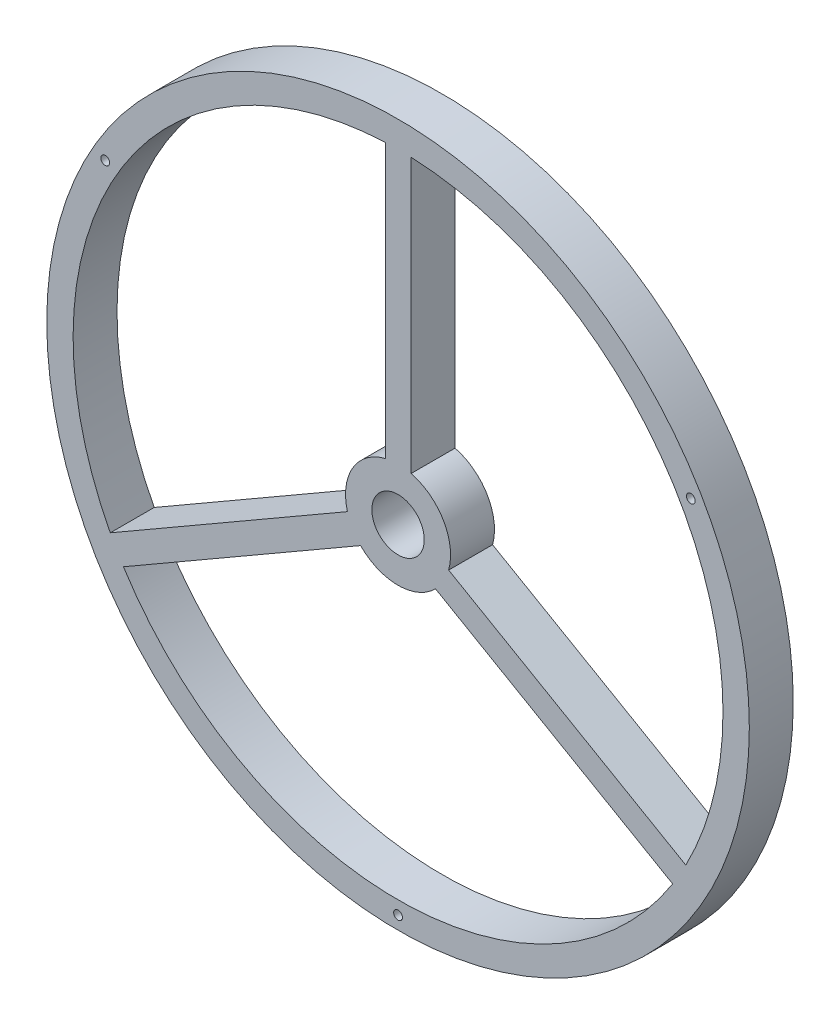
ISO-10303-21;
HEADER;
FILE_DESCRIPTION(('STEP AP214'),'2;1');
FILE_NAME('part.step','',(''),(''),'','','');
FILE_SCHEMA(('AUTOMOTIVE_DESIGN { 1 0 10303 214 1 1 1 1 }'));
ENDSEC;
DATA;
#1=APPLICATION_CONTEXT('core data for automotive mechanical design processes');
#2=APPLICATION_PROTOCOL_DEFINITION('international standard','automotive_design',2000,#1);
#3=PRODUCT_CONTEXT('',#1,'mechanical');
#4=PRODUCT('Part','Part','',(#3));
#5=PRODUCT_RELATED_PRODUCT_CATEGORY('part','',(#4));
#6=PRODUCT_DEFINITION_FORMATION('','',#4);
#7=PRODUCT_DEFINITION_CONTEXT('part definition',#1,'design');
#8=PRODUCT_DEFINITION('design','',#6,#7);
#9=PRODUCT_DEFINITION_SHAPE('','',#8);
#10=(LENGTH_UNIT() NAMED_UNIT(*) SI_UNIT(.MILLI.,.METRE.));
#11=(NAMED_UNIT(*) PLANE_ANGLE_UNIT() SI_UNIT($,.RADIAN.));
#12=(NAMED_UNIT(*) SI_UNIT($,.STERADIAN.) SOLID_ANGLE_UNIT());
#13=UNCERTAINTY_MEASURE_WITH_UNIT(LENGTH_MEASURE(1.E-05),#10,'distance_accuracy_value','');
#14=(GEOMETRIC_REPRESENTATION_CONTEXT(3) GLOBAL_UNCERTAINTY_ASSIGNED_CONTEXT((#13)) GLOBAL_UNIT_ASSIGNED_CONTEXT((#10,
#11,#12)) REPRESENTATION_CONTEXT('',''));
#15=CARTESIAN_POINT('',(0.,0.,0.));
#16=DIRECTION('',(0.,0.,1.));
#17=DIRECTION('',(1.,0.,0.));
#18=AXIS2_PLACEMENT_3D('',#15,#16,#17);
#19=CARTESIAN_POINT('',(46.8483422096142,0.,5.));
#20=DIRECTION('',(1.,0.,0.));
#21=DIRECTION('',(0.,1.,0.));
#22=AXIS2_PLACEMENT_3D('',#19,#20,#21);
#23=PLANE('',#22);
#24=DIRECTION('',(0.,-1.,0.));
#25=VECTOR('',#24,1.);
#26=CARTESIAN_POINT('',(46.8483422096142,0.,0.));
#27=LINE('',#26,#25);
#28=CARTESIAN_POINT('',(46.8483422096142,64.8965575846798,0.));
#29=VERTEX_POINT('',#28);
#30=CARTESIAN_POINT('',(46.8483422096142,33.7276182030901,0.));
#31=VERTEX_POINT('',#30);
#32=EDGE_CURVE('E188',#29,#31,#27,.T.);
#33=ORIENTED_EDGE('',*,*,#32,.T.);
#34=DIRECTION('',(0.,0.,-1.));
#35=VECTOR('',#34,1.);
#36=CARTESIAN_POINT('',(46.8483422096142,33.7276182030901,5.));
#37=LINE('',#36,#35);
#38=CARTESIAN_POINT('',(46.8483422096142,33.7276182030901,5.));
#39=VERTEX_POINT('',#38);
#40=EDGE_CURVE('E11',#39,#31,#37,.T.);
#41=ORIENTED_EDGE('',*,*,#40,.F.);
#42=DIRECTION('',(0.,-1.,0.));
#43=VECTOR('',#42,1.);
#44=CARTESIAN_POINT('',(46.8483422096142,0.,5.));
#45=LINE('',#44,#43);
#46=CARTESIAN_POINT('',(46.8483422096142,64.8965575846798,5.));
#47=VERTEX_POINT('',#46);
#48=EDGE_CURVE('E140',#47,#39,#45,.T.);
#49=ORIENTED_EDGE('',*,*,#48,.F.);
#50=DIRECTION('',(0.,0.,-1.));
#51=VECTOR('',#50,1.);
#52=CARTESIAN_POINT('',(46.8483422096142,64.8965575846798,5.));
#53=LINE('',#52,#51);
#54=EDGE_CURVE('E54',#47,#29,#53,.T.);
#55=ORIENTED_EDGE('',*,*,#54,.T.);
#56=EDGE_LOOP('',(#33,#41,#49,#55));
#57=FACE_BOUND('',#56,.T.);
#58=ADVANCED_FACE('F35',(#57),#23,.F.);
#59=CARTESIAN_POINT('',(48.2964743549606,27.9249074552953,5.));
#60=DIRECTION('',(0.,0.,-1.));
#61=DIRECTION('',(-1.,0.,0.));
#62=AXIS2_PLACEMENT_3D('',#59,#60,#61);
#63=CYLINDRICAL_SURFACE('',#62,5.98068045735259);
#64=CARTESIAN_POINT('',(48.2964743549606,27.9249074552953,0.));
#65=DIRECTION('',(0.,0.,1.));
#66=DIRECTION('',(1.,0.,0.));
#67=AXIS2_PLACEMENT_3D('',#64,#65,#66);
#68=CIRCLE('',#67,5.98068045735259);
#69=CARTESIAN_POINT('',(42.5326031909079,26.329185694724,0.));
#70=VERTEX_POINT('',#69);
#71=EDGE_CURVE('E147',#31,#70,#68,.T.);
#72=ORIENTED_EDGE('',*,*,#71,.T.);
#73=DIRECTION('',(0.,0.,-1.));
#74=VECTOR('',#73,1.);
#75=CARTESIAN_POINT('',(42.5326031909079,26.329185694724,5.));
#76=LINE('',#75,#74);
#77=CARTESIAN_POINT('',(42.5326031909079,26.329185694724,5.));
#78=VERTEX_POINT('',#77);
#79=EDGE_CURVE('E45',#78,#70,#76,.T.);
#80=ORIENTED_EDGE('',*,*,#79,.F.);
#81=CARTESIAN_POINT('',(48.2964743549606,27.9249074552953,5.));
#82=DIRECTION('',(0.,0.,1.));
#83=DIRECTION('',(1.,0.,0.));
#84=AXIS2_PLACEMENT_3D('',#81,#82,#83);
#85=CIRCLE('',#84,5.98068045735259);
#86=EDGE_CURVE('E133',#39,#78,#85,.T.);
#87=ORIENTED_EDGE('',*,*,#86,.F.);
#88=ORIENTED_EDGE('',*,*,#40,.T.);
#89=EDGE_LOOP('',(#72,#80,#87,#88));
#90=FACE_BOUND('',#89,.T.);
#91=ADVANCED_FACE('F146',(#90),#63,.T.);
#92=CARTESIAN_POINT('',(-0.767721038567435,1.32973184483834,5.));
#93=DIRECTION('',(-0.5,0.866025403784438,0.));
#94=DIRECTION('',(-0.866025403784438,-0.5,0.));
#95=AXIS2_PLACEMENT_3D('',#92,#93,#94);
#96=PLANE('',#95);
#97=DIRECTION('',(0.866025403784439,0.5,0.));
#98=VECTOR('',#97,1.);
#99=CARTESIAN_POINT('',(-0.767721038567435,1.32973184483834,0.));
#100=LINE('',#99,#98);
#101=CARTESIAN_POINT('',(15.5298770966634,10.7391545153582,0.));
#102=VERTEX_POINT('',#101);
#103=EDGE_CURVE('E190',#102,#70,#100,.T.);
#104=ORIENTED_EDGE('',*,*,#103,.F.);
#105=DIRECTION('',(0.,0.,-1.));
#106=VECTOR('',#105,1.);
#107=CARTESIAN_POINT('',(15.5298770966634,10.7391545153582,5.));
#108=LINE('',#107,#106);
#109=CARTESIAN_POINT('',(15.5298770966634,10.7391545153582,5.));
#110=VERTEX_POINT('',#109);
#111=EDGE_CURVE('E92',#110,#102,#108,.T.);
#112=ORIENTED_EDGE('',*,*,#111,.F.);
#113=DIRECTION('',(0.866025403784439,0.5,0.));
#114=VECTOR('',#113,1.);
#115=CARTESIAN_POINT('',(-0.767721038567435,1.32973184483834,5.));
#116=LINE('',#115,#114);
#117=EDGE_CURVE('E139',#110,#78,#116,.T.);
#118=ORIENTED_EDGE('',*,*,#117,.T.);
#119=ORIENTED_EDGE('',*,*,#79,.T.);
#120=EDGE_LOOP('',(#104,#112,#118,#119));
#121=FACE_BOUND('',#120,.T.);
#122=ADVANCED_FACE('F151',(#121),#96,.T.);
#123=CARTESIAN_POINT('',(44.0326031909079,23.7311094833707,0.));
#124=VERTEX_POINT('',#123);
#125=CARTESIAN_POINT('',(52.5603455190133,23.7311094833707,0.));
#126=VERTEX_POINT('',#125);
#127=EDGE_CURVE('E172',#124,#126,#68,.T.);
#128=ORIENTED_EDGE('',*,*,#127,.T.);
#129=DIRECTION('',(0.,0.,-1.));
#130=VECTOR('',#129,1.);
#131=CARTESIAN_POINT('',(52.5603455190133,23.7311094833707,5.));
#132=LINE('',#131,#130);
#133=CARTESIAN_POINT('',(52.5603455190133,23.7311094833707,5.));
#134=VERTEX_POINT('',#133);
#135=EDGE_CURVE('E199',#134,#126,#132,.T.);
#136=ORIENTED_EDGE('',*,*,#135,.F.);
#137=CARTESIAN_POINT('',(44.0326031909079,23.7311094833707,5.));
#138=VERTEX_POINT('',#137);
#139=EDGE_CURVE('E144',#138,#134,#85,.T.);
#140=ORIENTED_EDGE('',*,*,#139,.F.);
#141=DIRECTION('',(0.,0.,-1.));
#142=VECTOR('',#141,1.);
#143=CARTESIAN_POINT('',(44.0326031909079,23.7311094833707,5.));
#144=LINE('',#143,#142);
#145=EDGE_CURVE('E201',#138,#124,#144,.T.);
#146=ORIENTED_EDGE('',*,*,#145,.T.);
#147=EDGE_LOOP('',(#128,#136,#140,#146));
#148=FACE_BOUND('',#147,.T.);
#149=ADVANCED_FACE('F303',(#148),#63,.T.);
#150=CARTESIAN_POINT('',(23.4159582160477,40.5576293381045,5.));
#151=DIRECTION('',(0.5,0.866025403784439,0.));
#152=DIRECTION('',(-0.866025403784439,0.5,0.));
#153=AXIS2_PLACEMENT_3D('',#150,#151,#152);
#154=PLANE('',#153);
#155=DIRECTION('',(0.866025403784439,-0.5,0.));
#156=VECTOR('',#155,1.);
#157=CARTESIAN_POINT('',(23.4159582160477,40.5576293381045,0.));
#158=LINE('',#157,#156);
#159=CARTESIAN_POINT('',(79.5630716132577,8.14107830400491,0.));
#160=VERTEX_POINT('',#159);
#161=EDGE_CURVE('E182',#126,#160,#158,.T.);
#162=ORIENTED_EDGE('',*,*,#161,.T.);
#163=DIRECTION('',(0.,0.,-1.));
#164=VECTOR('',#163,1.);
#165=CARTESIAN_POINT('',(79.5630716132577,8.14107830400491,5.));
#166=LINE('',#165,#164);
#167=CARTESIAN_POINT('',(79.5630716132577,8.14107830400491,5.));
#168=VERTEX_POINT('',#167);
#169=EDGE_CURVE('E205',#168,#160,#166,.T.);
#170=ORIENTED_EDGE('',*,*,#169,.F.);
#171=DIRECTION('',(0.866025403784439,-0.5,0.));
#172=VECTOR('',#171,1.);
#173=CARTESIAN_POINT('',(23.4159582160477,40.5576293381045,5.));
#174=LINE('',#173,#172);
#175=EDGE_CURVE('E239',#134,#168,#174,.T.);
#176=ORIENTED_EDGE('',*,*,#175,.F.);
#177=ORIENTED_EDGE('',*,*,#135,.T.);
#178=EDGE_LOOP('',(#162,#170,#176,#177));
#179=FACE_BOUND('',#178,.T.);
#180=ADVANCED_FACE('F311',(#179),#154,.F.);
#181=CARTESIAN_POINT('',(48.2964743549606,27.9249074552953,5.));
#182=DIRECTION('',(0.,0.,-1.));
#183=DIRECTION('',(-1.,0.,0.));
#184=AXIS2_PLACEMENT_3D('',#181,#182,#183);
#185=CYLINDRICAL_SURFACE('',#184,37.);
#186=CARTESIAN_POINT('',(48.2964743549606,27.9249074552953,0.));
#187=DIRECTION('',(0.,0.,1.));
#188=DIRECTION('',(1.,0.,0.));
#189=AXIS2_PLACEMENT_3D('',#186,#187,#188);
#190=CIRCLE('',#189,37.);
#191=CARTESIAN_POINT('',(17.0298770966634,8.14107830400491,0.));
#192=VERTEX_POINT('',#191);
#193=EDGE_CURVE('E180',#192,#160,#190,.T.);
#194=ORIENTED_EDGE('',*,*,#193,.F.);
#195=DIRECTION('',(0.,0.,-1.));
#196=VECTOR('',#195,1.);
#197=CARTESIAN_POINT('',(17.0298770966634,8.14107830400491,5.));
#198=LINE('',#197,#196);
#199=CARTESIAN_POINT('',(17.0298770966634,8.14107830400491,5.));
#200=VERTEX_POINT('',#199);
#201=EDGE_CURVE('E203',#200,#192,#198,.T.);
#202=ORIENTED_EDGE('',*,*,#201,.F.);
#203=CARTESIAN_POINT('',(48.2964743549606,27.9249074552953,5.));
#204=DIRECTION('',(0.,0.,1.));
#205=DIRECTION('',(1.,0.,0.));
#206=AXIS2_PLACEMENT_3D('',#203,#204,#205);
#207=CIRCLE('',#206,37.);
#208=EDGE_CURVE('E156',#200,#168,#207,.T.);
#209=ORIENTED_EDGE('',*,*,#208,.T.);
#210=ORIENTED_EDGE('',*,*,#169,.T.);
#211=EDGE_LOOP('',(#194,#202,#209,#210));
#212=FACE_BOUND('',#211,.T.);
#213=ADVANCED_FACE('F313',(#212),#185,.F.);
#214=CARTESIAN_POINT('',(54.0603455190133,26.329185694724,0.));
#215=VERTEX_POINT('',#214);
#216=CARTESIAN_POINT('',(49.7879309777147,33.716633957419,0.));
#217=VERTEX_POINT('',#216);
#218=EDGE_CURVE('E167',#215,#217,#68,.T.);
#219=ORIENTED_EDGE('',*,*,#218,.T.);
#220=DIRECTION('',(0.,0.,-1.));
#221=VECTOR('',#220,1.);
#222=CARTESIAN_POINT('',(49.7879309777147,33.716633957419,5.));
#223=LINE('',#222,#221);
#224=CARTESIAN_POINT('',(49.7879309777147,33.716633957419,5.));
#225=VERTEX_POINT('',#224);
#226=EDGE_CURVE('E39',#225,#217,#223,.T.);
#227=ORIENTED_EDGE('',*,*,#226,.F.);
#228=CARTESIAN_POINT('',(54.0603455190133,26.329185694724,5.));
#229=VERTEX_POINT('',#228);
#230=EDGE_CURVE('E105',#229,#225,#85,.T.);
#231=ORIENTED_EDGE('',*,*,#230,.F.);
#232=DIRECTION('',(0.,0.,-1.));
#233=VECTOR('',#232,1.);
#234=CARTESIAN_POINT('',(54.0603455190133,26.329185694724,5.));
#235=LINE('',#234,#233);
#236=EDGE_CURVE('E166',#229,#215,#235,.T.);
#237=ORIENTED_EDGE('',*,*,#236,.T.);
#238=EDGE_LOOP('',(#219,#227,#231,#237));
#239=FACE_BOUND('',#238,.T.);
#240=ADVANCED_FACE('F222',(#239),#63,.T.);
#241=CARTESIAN_POINT('',(49.7879309777147,0.,5.));
#242=DIRECTION('',(1.,0.,0.));
#243=DIRECTION('',(0.,1.,0.));
#244=AXIS2_PLACEMENT_3D('',#241,#242,#243);
#245=PLANE('',#244);
#246=DIRECTION('',(0.,-1.,0.));
#247=VECTOR('',#246,1.);
#248=CARTESIAN_POINT('',(49.7879309777147,0.,0.));
#249=LINE('',#248,#247);
#250=CARTESIAN_POINT('',(49.7879309777147,64.8948351958582,0.));
#251=VERTEX_POINT('',#250);
#252=EDGE_CURVE('E170',#251,#217,#249,.T.);
#253=ORIENTED_EDGE('',*,*,#252,.F.);
#254=DIRECTION('',(0.,0.,-1.));
#255=VECTOR('',#254,1.);
#256=CARTESIAN_POINT('',(49.7879309777147,64.8948351958582,5.));
#257=LINE('',#256,#255);
#258=CARTESIAN_POINT('',(49.7879309777147,64.8948351958582,5.));
#259=VERTEX_POINT('',#258);
#260=EDGE_CURVE('E212',#259,#251,#257,.T.);
#261=ORIENTED_EDGE('',*,*,#260,.F.);
#262=DIRECTION('',(0.,-1.,0.));
#263=VECTOR('',#262,1.);
#264=CARTESIAN_POINT('',(49.7879309777147,0.,5.));
#265=LINE('',#264,#263);
#266=EDGE_CURVE('E219',#259,#225,#265,.T.);
#267=ORIENTED_EDGE('',*,*,#266,.T.);
#268=ORIENTED_EDGE('',*,*,#226,.T.);
#269=EDGE_LOOP('',(#253,#261,#267,#268));
#270=FACE_BOUND('',#269,.T.);
#271=ADVANCED_FACE('F37',(#270),#245,.T.);
#272=CARTESIAN_POINT('',(81.0630716132577,10.7391545153582,0.));
#273=VERTEX_POINT('',#272);
#274=EDGE_CURVE('E175',#273,#251,#190,.T.);
#275=ORIENTED_EDGE('',*,*,#274,.F.);
#276=DIRECTION('',(0.,0.,-1.));
#277=VECTOR('',#276,1.);
#278=CARTESIAN_POINT('',(81.0630716132577,10.7391545153582,5.));
#279=LINE('',#278,#277);
#280=CARTESIAN_POINT('',(81.0630716132577,10.7391545153582,5.));
#281=VERTEX_POINT('',#280);
#282=EDGE_CURVE('E211',#281,#273,#279,.T.);
#283=ORIENTED_EDGE('',*,*,#282,.F.);
#284=EDGE_CURVE('E157',#281,#259,#207,.T.);
#285=ORIENTED_EDGE('',*,*,#284,.T.);
#286=ORIENTED_EDGE('',*,*,#260,.T.);
#287=EDGE_LOOP('',(#275,#283,#285,#286));
#288=FACE_BOUND('',#287,.T.);
#289=ADVANCED_FACE('F228',(#288),#185,.F.);
#290=CARTESIAN_POINT('',(48.2964743549606,27.9249074552953,5.));
#291=DIRECTION('',(0.,0.,-1.));
#292=DIRECTION('',(-1.,0.,0.));
#293=AXIS2_PLACEMENT_3D('',#290,#291,#292);
#294=CYLINDRICAL_SURFACE('',#293,40.);
#295=CARTESIAN_POINT('',(48.2964743549606,27.9249074552953,5.));
#296=DIRECTION('',(0.,0.,1.));
#297=DIRECTION('',(1.,0.,0.));
#298=AXIS2_PLACEMENT_3D('',#295,#296,#297);
#299=CIRCLE('',#298,40.);
#300=CARTESIAN_POINT('',(88.2964743549606,27.9249074552953,5.));
#301=VERTEX_POINT('',#300);
#302=EDGE_CURVE('E154',#301,#301,#299,.T.);
#303=ORIENTED_EDGE('',*,*,#302,.F.);
#304=EDGE_LOOP('',(#303));
#305=FACE_BOUND('',#304,.T.);
#306=CARTESIAN_POINT('',(48.2964743549606,27.9249074552953,0.));
#307=DIRECTION('',(0.,0.,1.));
#308=DIRECTION('',(1.,0.,0.));
#309=AXIS2_PLACEMENT_3D('',#306,#307,#308);
#310=CIRCLE('',#309,40.);
#311=CARTESIAN_POINT('',(88.2964743549606,27.9249074552953,0.));
#312=VERTEX_POINT('',#311);
#313=EDGE_CURVE('E192',#312,#312,#310,.T.);
#314=ORIENTED_EDGE('',*,*,#313,.T.);
#315=EDGE_LOOP('',(#314));
#316=FACE_BOUND('',#315,.T.);
#317=ADVANCED_FACE('F325',(#305,#316),#294,.T.);
#318=EDGE_CURVE('E179',#29,#102,#190,.T.);
#319=ORIENTED_EDGE('',*,*,#318,.F.);
#320=ORIENTED_EDGE('',*,*,#54,.F.);
#321=EDGE_CURVE('E152',#47,#110,#207,.T.);
#322=ORIENTED_EDGE('',*,*,#321,.T.);
#323=ORIENTED_EDGE('',*,*,#111,.T.);
#324=EDGE_LOOP('',(#319,#320,#322,#323));
#325=FACE_BOUND('',#324,.T.);
#326=ADVANCED_FACE('F309',(#325),#185,.F.);
#327=CARTESIAN_POINT('',(0.732278961432563,-1.26834436651497,5.));
#328=DIRECTION('',(0.5,-0.866025403784439,0.));
#329=DIRECTION('',(0.866025403784439,0.5,0.));
#330=AXIS2_PLACEMENT_3D('',#327,#328,#329);
#331=PLANE('',#330);
#332=DIRECTION('',(-0.866025403784439,-0.5,0.));
#333=VECTOR('',#332,1.);
#334=CARTESIAN_POINT('',(0.732278961432563,-1.26834436651497,0.));
#335=LINE('',#334,#333);
#336=EDGE_CURVE('E185',#124,#192,#335,.T.);
#337=ORIENTED_EDGE('',*,*,#336,.F.);
#338=ORIENTED_EDGE('',*,*,#145,.F.);
#339=DIRECTION('',(-0.866025403784439,-0.5,0.));
#340=VECTOR('',#339,1.);
#341=CARTESIAN_POINT('',(0.732278961432563,-1.26834436651497,5.));
#342=LINE('',#341,#340);
#343=EDGE_CURVE('E238',#138,#200,#342,.T.);
#344=ORIENTED_EDGE('',*,*,#343,.T.);
#345=ORIENTED_EDGE('',*,*,#201,.T.);
#346=EDGE_LOOP('',(#337,#338,#344,#345));
#347=FACE_BOUND('',#346,.T.);
#348=ADVANCED_FACE('F306',(#347),#331,.T.);
#349=CARTESIAN_POINT('',(24.9159582160477,43.1557055494579,5.));
#350=DIRECTION('',(-0.5,-0.866025403784439,0.));
#351=DIRECTION('',(0.866025403784439,-0.5,0.));
#352=AXIS2_PLACEMENT_3D('',#349,#350,#351);
#353=PLANE('',#352);
#354=DIRECTION('',(-0.866025403784439,0.5,0.));
#355=VECTOR('',#354,1.);
#356=CARTESIAN_POINT('',(24.9159582160477,43.1557055494579,0.));
#357=LINE('',#356,#355);
#358=EDGE_CURVE('E178',#273,#215,#357,.T.);
#359=ORIENTED_EDGE('',*,*,#358,.T.);
#360=ORIENTED_EDGE('',*,*,#236,.F.);
#361=DIRECTION('',(-0.866025403784439,0.5,0.));
#362=VECTOR('',#361,1.);
#363=CARTESIAN_POINT('',(24.9159582160477,43.1557055494579,5.));
#364=LINE('',#363,#362);
#365=EDGE_CURVE('E232',#281,#229,#364,.T.);
#366=ORIENTED_EDGE('',*,*,#365,.F.);
#367=ORIENTED_EDGE('',*,*,#282,.T.);
#368=EDGE_LOOP('',(#359,#360,#366,#367));
#369=FACE_BOUND('',#368,.T.);
#370=ADVANCED_FACE('F233',(#369),#353,.F.);
#371=CARTESIAN_POINT('',(48.2964743549606,27.9249074552953,5.));
#372=DIRECTION('',(0.,0.,-1.));
#373=DIRECTION('',(-1.,0.,0.));
#374=AXIS2_PLACEMENT_3D('',#371,#372,#373);
#375=CYLINDRICAL_SURFACE('',#374,2.98068045735259);
#376=CARTESIAN_POINT('',(48.2964743549606,27.9249074552953,5.));
#377=DIRECTION('',(0.,0.,1.));
#378=DIRECTION('',(1.,0.,0.));
#379=AXIS2_PLACEMENT_3D('',#376,#377,#378);
#380=CIRCLE('',#379,2.98068045735259);
#381=CARTESIAN_POINT('',(51.2771548123132,27.9249074552953,5.));
#382=VERTEX_POINT('',#381);
#383=EDGE_CURVE('E163',#382,#382,#380,.T.);
#384=ORIENTED_EDGE('',*,*,#383,.T.);
#385=EDGE_LOOP('',(#384));
#386=FACE_BOUND('',#385,.T.);
#387=CARTESIAN_POINT('',(48.2964743549606,27.9249074552953,0.));
#388=DIRECTION('',(0.,0.,1.));
#389=DIRECTION('',(1.,0.,0.));
#390=AXIS2_PLACEMENT_3D('',#387,#388,#389);
#391=CIRCLE('',#390,2.98068045735259);
#392=CARTESIAN_POINT('',(51.2771548123132,27.9249074552953,0.));
#393=VERTEX_POINT('',#392);
#394=EDGE_CURVE('E195',#393,#393,#391,.T.);
#395=ORIENTED_EDGE('',*,*,#394,.F.);
#396=EDGE_LOOP('',(#395));
#397=FACE_BOUND('',#396,.T.);
#398=ADVANCED_FACE('F279',(#386,#397),#375,.F.);
#399=CARTESIAN_POINT('',(0.,0.,5.));
#400=DIRECTION('',(0.,0.,1.));
#401=DIRECTION('',(1.,0.,0.));
#402=AXIS2_PLACEMENT_3D('',#399,#400,#401);
#403=PLANE('',#402);
#404=CARTESIAN_POINT('',(14.9544963092596,47.1749074552951,5.));
#405=DIRECTION('',(0.,0.,1.));
#406=DIRECTION('',(1.,0.,0.));
#407=AXIS2_PLACEMENT_3D('',#404,#405,#406);
#408=CIRCLE('',#407,0.500000000000022);
#409=CARTESIAN_POINT('',(15.4544963092596,47.1749074552951,5.));
#410=VERTEX_POINT('',#409);
#411=EDGE_CURVE('E262',#410,#410,#408,.T.);
#412=ORIENTED_EDGE('',*,*,#411,.F.);
#413=EDGE_LOOP('',(#412));
#414=FACE_BOUND('',#413,.T.);
#415=CARTESIAN_POINT('',(48.2964743549606,-10.5750925447047,5.));
#416=DIRECTION('',(0.,0.,1.));
#417=DIRECTION('',(1.,0.,0.));
#418=AXIS2_PLACEMENT_3D('',#415,#416,#417);
#419=CIRCLE('',#418,0.499999999999999);
#420=CARTESIAN_POINT('',(48.7964743549606,-10.5750925447047,5.));
#421=VERTEX_POINT('',#420);
#422=EDGE_CURVE('E256',#421,#421,#419,.T.);
#423=ORIENTED_EDGE('',*,*,#422,.F.);
#424=EDGE_LOOP('',(#423));
#425=FACE_BOUND('',#424,.T.);
#426=CARTESIAN_POINT('',(81.6384524006614,47.1749074552953,5.));
#427=DIRECTION('',(0.,0.,1.));
#428=DIRECTION('',(1.,0.,0.));
#429=AXIS2_PLACEMENT_3D('',#426,#427,#428);
#430=CIRCLE('',#429,0.499999999999999);
#431=CARTESIAN_POINT('',(82.1384524006614,47.1749074552953,5.));
#432=VERTEX_POINT('',#431);
#433=EDGE_CURVE('E250',#432,#432,#430,.T.);
#434=ORIENTED_EDGE('',*,*,#433,.F.);
#435=EDGE_LOOP('',(#434));
#436=FACE_BOUND('',#435,.T.);
#437=ORIENTED_EDGE('',*,*,#230,.T.);
#438=ORIENTED_EDGE('',*,*,#266,.F.);
#439=ORIENTED_EDGE('',*,*,#284,.F.);
#440=ORIENTED_EDGE('',*,*,#365,.T.);
#441=EDGE_LOOP('',(#437,#438,#439,#440));
#442=FACE_BOUND('',#441,.T.);
#443=ORIENTED_EDGE('',*,*,#139,.T.);
#444=ORIENTED_EDGE('',*,*,#175,.T.);
#445=ORIENTED_EDGE('',*,*,#208,.F.);
#446=ORIENTED_EDGE('',*,*,#343,.F.);
#447=EDGE_LOOP('',(#443,#444,#445,#446));
#448=FACE_BOUND('',#447,.T.);
#449=ORIENTED_EDGE('',*,*,#48,.T.);
#450=ORIENTED_EDGE('',*,*,#86,.T.);
#451=ORIENTED_EDGE('',*,*,#117,.F.);
#452=ORIENTED_EDGE('',*,*,#321,.F.);
#453=EDGE_LOOP('',(#449,#450,#451,#452));
#454=FACE_BOUND('',#453,.T.);
#455=ORIENTED_EDGE('',*,*,#302,.T.);
#456=EDGE_LOOP('',(#455));
#457=FACE_BOUND('',#456,.T.);
#458=ORIENTED_EDGE('',*,*,#383,.F.);
#459=EDGE_LOOP('',(#458));
#460=FACE_BOUND('',#459,.T.);
#461=ADVANCED_FACE('F135',(#414,#425,#436,#442,#448,#454,#457,#460),#403,.T.);
#462=CARTESIAN_POINT('',(0.,0.,0.));
#463=DIRECTION('',(0.,0.,1.));
#464=DIRECTION('',(1.,0.,0.));
#465=AXIS2_PLACEMENT_3D('',#462,#463,#464);
#466=PLANE('',#465);
#467=CARTESIAN_POINT('',(14.9544963092596,47.1749074552951,0.));
#468=DIRECTION('',(0.,0.,1.));
#469=DIRECTION('',(1.,0.,0.));
#470=AXIS2_PLACEMENT_3D('',#467,#468,#469);
#471=CIRCLE('',#470,0.500000000000022);
#472=CARTESIAN_POINT('',(15.4544963092596,47.1749074552951,0.));
#473=VERTEX_POINT('',#472);
#474=EDGE_CURVE('E171',#473,#473,#471,.T.);
#475=ORIENTED_EDGE('',*,*,#474,.T.);
#476=EDGE_LOOP('',(#475));
#477=FACE_BOUND('',#476,.T.);
#478=CARTESIAN_POINT('',(48.2964743549606,-10.5750925447047,0.));
#479=DIRECTION('',(0.,0.,1.));
#480=DIRECTION('',(1.,0.,0.));
#481=AXIS2_PLACEMENT_3D('',#478,#479,#480);
#482=CIRCLE('',#481,0.499999999999999);
#483=CARTESIAN_POINT('',(48.7964743549606,-10.5750925447047,0.));
#484=VERTEX_POINT('',#483);
#485=EDGE_CURVE('E259',#484,#484,#482,.T.);
#486=ORIENTED_EDGE('',*,*,#485,.T.);
#487=EDGE_LOOP('',(#486));
#488=FACE_BOUND('',#487,.T.);
#489=CARTESIAN_POINT('',(81.6384524006614,47.1749074552953,0.));
#490=DIRECTION('',(0.,0.,1.));
#491=DIRECTION('',(1.,0.,0.));
#492=AXIS2_PLACEMENT_3D('',#489,#490,#491);
#493=CIRCLE('',#492,0.499999999999999);
#494=CARTESIAN_POINT('',(82.1384524006614,47.1749074552953,0.));
#495=VERTEX_POINT('',#494);
#496=EDGE_CURVE('E253',#495,#495,#493,.T.);
#497=ORIENTED_EDGE('',*,*,#496,.T.);
#498=EDGE_LOOP('',(#497));
#499=FACE_BOUND('',#498,.T.);
#500=ORIENTED_EDGE('',*,*,#218,.F.);
#501=ORIENTED_EDGE('',*,*,#358,.F.);
#502=ORIENTED_EDGE('',*,*,#274,.T.);
#503=ORIENTED_EDGE('',*,*,#252,.T.);
#504=EDGE_LOOP('',(#500,#501,#502,#503));
#505=FACE_BOUND('',#504,.T.);
#506=ORIENTED_EDGE('',*,*,#127,.F.);
#507=ORIENTED_EDGE('',*,*,#336,.T.);
#508=ORIENTED_EDGE('',*,*,#193,.T.);
#509=ORIENTED_EDGE('',*,*,#161,.F.);
#510=EDGE_LOOP('',(#506,#507,#508,#509));
#511=FACE_BOUND('',#510,.T.);
#512=ORIENTED_EDGE('',*,*,#32,.F.);
#513=ORIENTED_EDGE('',*,*,#318,.T.);
#514=ORIENTED_EDGE('',*,*,#103,.T.);
#515=ORIENTED_EDGE('',*,*,#71,.F.);
#516=EDGE_LOOP('',(#512,#513,#514,#515));
#517=FACE_BOUND('',#516,.T.);
#518=ORIENTED_EDGE('',*,*,#313,.F.);
#519=EDGE_LOOP('',(#518));
#520=FACE_BOUND('',#519,.T.);
#521=ORIENTED_EDGE('',*,*,#394,.T.);
#522=EDGE_LOOP('',(#521));
#523=FACE_BOUND('',#522,.T.);
#524=ADVANCED_FACE('F226',(#477,#488,#499,#505,#511,#517,#520,#523),#466,.F.);
#525=CARTESIAN_POINT('',(81.6384524006614,47.1749074552953,0.));
#526=DIRECTION('',(0.,0.,1.));
#527=DIRECTION('',(1.,0.,0.));
#528=AXIS2_PLACEMENT_3D('',#525,#526,#527);
#529=CYLINDRICAL_SURFACE('',#528,0.499999999999999);
#530=ORIENTED_EDGE('',*,*,#496,.F.);
#531=EDGE_LOOP('',(#530));
#532=FACE_BOUND('',#531,.T.);
#533=ORIENTED_EDGE('',*,*,#433,.T.);
#534=EDGE_LOOP('',(#533));
#535=FACE_BOUND('',#534,.T.);
#536=ADVANCED_FACE('F285',(#532,#535),#529,.F.);
#537=CARTESIAN_POINT('',(48.2964743549606,-10.5750925447047,0.));
#538=DIRECTION('',(0.,0.,1.));
#539=DIRECTION('',(1.,0.,0.));
#540=AXIS2_PLACEMENT_3D('',#537,#538,#539);
#541=CYLINDRICAL_SURFACE('',#540,0.499999999999999);
#542=ORIENTED_EDGE('',*,*,#485,.F.);
#543=EDGE_LOOP('',(#542));
#544=FACE_BOUND('',#543,.T.);
#545=ORIENTED_EDGE('',*,*,#422,.T.);
#546=EDGE_LOOP('',(#545));
#547=FACE_BOUND('',#546,.T.);
#548=ADVANCED_FACE('F273',(#544,#547),#541,.F.);
#549=CARTESIAN_POINT('',(14.9544963092596,47.1749074552951,0.));
#550=DIRECTION('',(0.,0.,1.));
#551=DIRECTION('',(1.,0.,0.));
#552=AXIS2_PLACEMENT_3D('',#549,#550,#551);
#553=CYLINDRICAL_SURFACE('',#552,0.500000000000022);
#554=ORIENTED_EDGE('',*,*,#474,.F.);
#555=EDGE_LOOP('',(#554));
#556=FACE_BOUND('',#555,.T.);
#557=ORIENTED_EDGE('',*,*,#411,.T.);
#558=EDGE_LOOP('',(#557));
#559=FACE_BOUND('',#558,.T.);
#560=ADVANCED_FACE('F270',(#556,#559),#553,.F.);
#561=CLOSED_SHELL('',(#58,#91,#122,#149,#180,#213,#240,#271,#289,#317,#326,#348,#370,#398,#461,
#524,#536,#548,#560));
#562=MANIFOLD_SOLID_BREP('B2',#561);
#563=ADVANCED_BREP_SHAPE_REPRESENTATION('',(#18,#562),#14);
#564=SHAPE_DEFINITION_REPRESENTATION(#9,#563);
ENDSEC;
END-ISO-10303-21;
